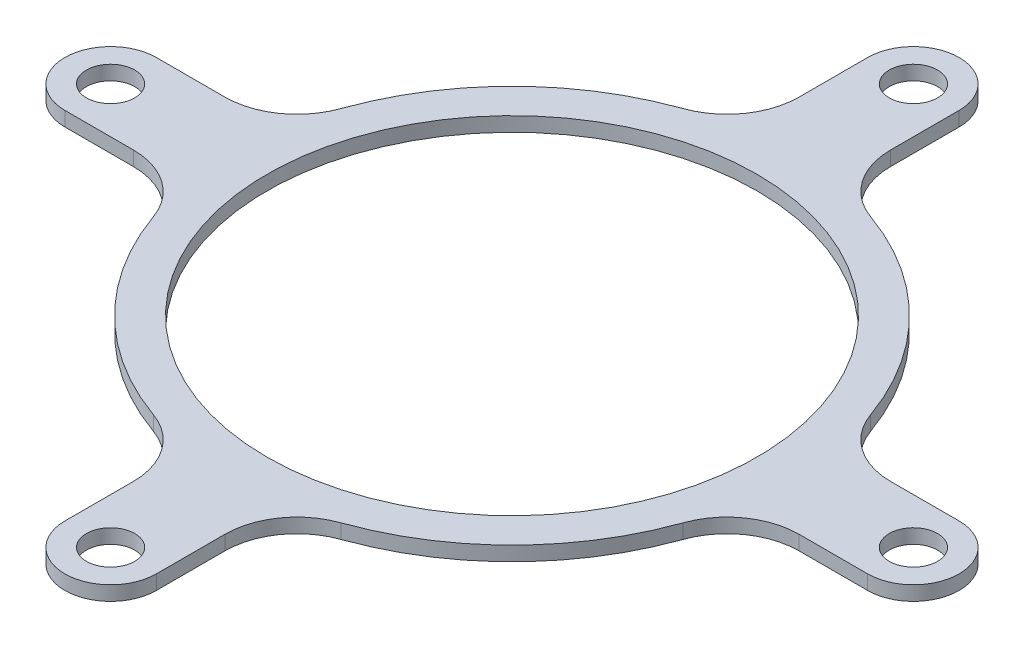
ISO-10303-21;
HEADER;
FILE_DESCRIPTION(('STEP AP214'),'2;1');
FILE_NAME('part.step','',(''),(''),'','','');
FILE_SCHEMA(('AUTOMOTIVE_DESIGN { 1 0 10303 214 1 1 1 1 }'));
ENDSEC;
DATA;
#1=APPLICATION_CONTEXT('core data for automotive mechanical design processes');
#2=APPLICATION_PROTOCOL_DEFINITION('international standard','automotive_design',2000,#1);
#3=PRODUCT_CONTEXT('',#1,'mechanical');
#4=PRODUCT('Part','Part','',(#3));
#5=PRODUCT_RELATED_PRODUCT_CATEGORY('part','',(#4));
#6=PRODUCT_DEFINITION_FORMATION('','',#4);
#7=PRODUCT_DEFINITION_CONTEXT('part definition',#1,'design');
#8=PRODUCT_DEFINITION('design','',#6,#7);
#9=PRODUCT_DEFINITION_SHAPE('','',#8);
#10=(LENGTH_UNIT() NAMED_UNIT(*) SI_UNIT(.MILLI.,.METRE.));
#11=(NAMED_UNIT(*) PLANE_ANGLE_UNIT() SI_UNIT($,.RADIAN.));
#12=(NAMED_UNIT(*) SI_UNIT($,.STERADIAN.) SOLID_ANGLE_UNIT());
#13=UNCERTAINTY_MEASURE_WITH_UNIT(LENGTH_MEASURE(1.E-05),#10,'distance_accuracy_value','');
#14=(GEOMETRIC_REPRESENTATION_CONTEXT(3) GLOBAL_UNCERTAINTY_ASSIGNED_CONTEXT((#13)) GLOBAL_UNIT_ASSIGNED_CONTEXT((#10,
#11,#12)) REPRESENTATION_CONTEXT('',''));
#15=CARTESIAN_POINT('',(0.,0.,0.));
#16=DIRECTION('',(0.,0.,1.));
#17=DIRECTION('',(1.,0.,0.));
#18=AXIS2_PLACEMENT_3D('',#15,#16,#17);
#19=CARTESIAN_POINT('',(0.,1.,0.));
#20=DIRECTION('',(0.,-1.,0.));
#21=DIRECTION('',(0.,0.,-1.));
#22=AXIS2_PLACEMENT_3D('',#19,#20,#21);
#23=CYLINDRICAL_SURFACE('',#22,39.);
#24=DIRECTION('',(0.,1.,0.));
#25=VECTOR('',#24,1.);
#26=CARTESIAN_POINT('',(36.7648599354392,-37.2866174201258,-13.0132653061228));
#27=LINE('',#26,#25);
#28=CARTESIAN_POINT('',(36.7648599354392,-1.,-13.0132653061228));
#29=VERTEX_POINT('',#28);
#30=CARTESIAN_POINT('',(36.7648599354392,1.,-13.0132653061228));
#31=VERTEX_POINT('',#30);
#32=EDGE_CURVE('E236',#29,#31,#27,.T.);
#33=ORIENTED_EDGE('',*,*,#32,.F.);
#34=CARTESIAN_POINT('',(0.,-1.,0.));
#35=DIRECTION('',(0.,1.,0.));
#36=DIRECTION('',(0.,0.,1.));
#37=AXIS2_PLACEMENT_3D('',#34,#35,#36);
#38=CIRCLE('',#37,39.);
#39=CARTESIAN_POINT('',(13.0132653061225,-1.,-36.7648599354393));
#40=VERTEX_POINT('',#39);
#41=EDGE_CURVE('E386',#29,#40,#38,.T.);
#42=ORIENTED_EDGE('',*,*,#41,.T.);
#43=DIRECTION('',(0.,1.,0.));
#44=VECTOR('',#43,1.);
#45=CARTESIAN_POINT('',(13.0132653061225,-37.2866174201258,-36.7648599354393));
#46=LINE('',#45,#44);
#47=CARTESIAN_POINT('',(13.0132653061225,1.,-36.7648599354393));
#48=VERTEX_POINT('',#47);
#49=EDGE_CURVE('E376',#40,#48,#46,.T.);
#50=ORIENTED_EDGE('',*,*,#49,.T.);
#51=CARTESIAN_POINT('',(0.,1.,0.));
#52=DIRECTION('',(0.,1.,0.));
#53=DIRECTION('',(0.,0.,1.));
#54=AXIS2_PLACEMENT_3D('',#51,#52,#53);
#55=CIRCLE('',#54,39.);
#56=EDGE_CURVE('E47',#31,#48,#55,.T.);
#57=ORIENTED_EDGE('',*,*,#56,.F.);
#58=EDGE_LOOP('',(#33,#42,#50,#57));
#59=FACE_BOUND('',#58,.T.);
#60=ADVANCED_FACE('F37',(#59),#23,.T.);
#61=CARTESIAN_POINT('',(13.0132653061224,-1.,36.7648599354393));
#62=VERTEX_POINT('',#61);
#63=CARTESIAN_POINT('',(36.7648599354394,-1.,13.0132653061221));
#64=VERTEX_POINT('',#63);
#65=EDGE_CURVE('E444',#62,#64,#38,.T.);
#66=ORIENTED_EDGE('',*,*,#65,.T.);
#67=DIRECTION('',(0.,1.,0.));
#68=VECTOR('',#67,1.);
#69=CARTESIAN_POINT('',(36.7648599354394,-37.2866174201258,13.0132653061221));
#70=LINE('',#69,#68);
#71=CARTESIAN_POINT('',(36.7648599354394,1.,13.0132653061221));
#72=VERTEX_POINT('',#71);
#73=EDGE_CURVE('E61',#64,#72,#70,.T.);
#74=ORIENTED_EDGE('',*,*,#73,.T.);
#75=CARTESIAN_POINT('',(13.0132653061225,1.,36.7648599354393));
#76=VERTEX_POINT('',#75);
#77=EDGE_CURVE('E224',#76,#72,#55,.T.);
#78=ORIENTED_EDGE('',*,*,#77,.F.);
#79=DIRECTION('',(0.,1.,0.));
#80=VECTOR('',#79,1.);
#81=CARTESIAN_POINT('',(13.0132653061224,-37.2866174201258,36.7648599354393));
#82=LINE('',#81,#80);
#83=EDGE_CURVE('E278',#62,#76,#82,.T.);
#84=ORIENTED_EDGE('',*,*,#83,.F.);
#85=EDGE_LOOP('',(#66,#74,#78,#84));
#86=FACE_BOUND('',#85,.T.);
#87=ADVANCED_FACE('F410',(#86),#23,.T.);
#88=CARTESIAN_POINT('',(-36.7648599354393,-1.,13.0132653061226));
#89=VERTEX_POINT('',#88);
#90=CARTESIAN_POINT('',(-13.0132653061225,-1.,36.7648599354393));
#91=VERTEX_POINT('',#90);
#92=EDGE_CURVE('E440',#89,#91,#38,.T.);
#93=ORIENTED_EDGE('',*,*,#92,.T.);
#94=DIRECTION('',(0.,1.,0.));
#95=VECTOR('',#94,1.);
#96=CARTESIAN_POINT('',(-13.0132653061225,-37.2866174201258,36.7648599354393));
#97=LINE('',#96,#95);
#98=CARTESIAN_POINT('',(-13.0132653061225,1.,36.7648599354393));
#99=VERTEX_POINT('',#98);
#100=EDGE_CURVE('E286',#91,#99,#97,.T.);
#101=ORIENTED_EDGE('',*,*,#100,.T.);
#102=CARTESIAN_POINT('',(-36.7648599354393,1.,13.0132653061226));
#103=VERTEX_POINT('',#102);
#104=EDGE_CURVE('E46',#103,#99,#55,.T.);
#105=ORIENTED_EDGE('',*,*,#104,.F.);
#106=DIRECTION('',(0.,1.,0.));
#107=VECTOR('',#106,1.);
#108=CARTESIAN_POINT('',(-36.7648599354392,-37.2866174201258,13.0132653061226));
#109=LINE('',#108,#107);
#110=EDGE_CURVE('E323',#89,#103,#109,.T.);
#111=ORIENTED_EDGE('',*,*,#110,.F.);
#112=EDGE_LOOP('',(#93,#101,#105,#111));
#113=FACE_BOUND('',#112,.T.);
#114=ADVANCED_FACE('F406',(#113),#23,.T.);
#115=CARTESIAN_POINT('',(0.,1.,0.));
#116=DIRECTION('',(0.,1.,0.));
#117=DIRECTION('',(0.,0.,1.));
#118=AXIS2_PLACEMENT_3D('',#115,#116,#117);
#119=PLANE('',#118);
#120=CARTESIAN_POINT('',(-13.0132653061225,1.,-36.7648599354393));
#121=VERTEX_POINT('',#120);
#122=CARTESIAN_POINT('',(-36.7648599354393,1.,-13.0132653061223));
#123=VERTEX_POINT('',#122);
#124=EDGE_CURVE('E11',#121,#123,#55,.T.);
#125=ORIENTED_EDGE('',*,*,#124,.T.);
#126=CARTESIAN_POINT('',(-46.1917470983725,1.,-16.3499999999998));
#127=DIRECTION('',(0.,-1.,0.));
#128=DIRECTION('',(1.,0.,0.));
#129=AXIS2_PLACEMENT_3D('',#126,#127,#128);
#130=CIRCLE('',#129,10.);
#131=CARTESIAN_POINT('',(-46.1917470983725,1.,-6.34999999999984));
#132=VERTEX_POINT('',#131);
#133=EDGE_CURVE('E311',#123,#132,#130,.T.);
#134=ORIENTED_EDGE('',*,*,#133,.T.);
#135=DIRECTION('',(-1.,0.,0.));
#136=VECTOR('',#135,1.);
#137=CARTESIAN_POINT('',(-55.7,1.,-6.34999999999981));
#138=LINE('',#137,#136);
#139=CARTESIAN_POINT('',(-55.7,1.,-6.34999999999981));
#140=VERTEX_POINT('',#139);
#141=EDGE_CURVE('E314',#132,#140,#138,.T.);
#142=ORIENTED_EDGE('',*,*,#141,.T.);
#143=CARTESIAN_POINT('',(-55.7,1.,1.94475510573563E-13));
#144=DIRECTION('',(0.,1.,0.));
#145=DIRECTION('',(-1.,0.,0.));
#146=AXIS2_PLACEMENT_3D('',#143,#144,#145);
#147=CIRCLE('',#146,6.35);
#148=CARTESIAN_POINT('',(-55.7,1.,6.3500000000002));
#149=VERTEX_POINT('',#148);
#150=EDGE_CURVE('E317',#140,#149,#147,.T.);
#151=ORIENTED_EDGE('',*,*,#150,.T.);
#152=DIRECTION('',(1.,0.,0.));
#153=VECTOR('',#152,1.);
#154=CARTESIAN_POINT('',(-46.1917470983724,1.,6.35000000000016));
#155=LINE('',#154,#153);
#156=CARTESIAN_POINT('',(-46.1917470983724,1.,6.35000000000016));
#157=VERTEX_POINT('',#156);
#158=EDGE_CURVE('E320',#149,#157,#155,.T.);
#159=ORIENTED_EDGE('',*,*,#158,.T.);
#160=CARTESIAN_POINT('',(-46.1917470983724,1.,16.3500000000002));
#161=DIRECTION('',(0.,-1.,0.));
#162=DIRECTION('',(-1.,0.,0.));
#163=AXIS2_PLACEMENT_3D('',#160,#161,#162);
#164=CIRCLE('',#163,10.);
#165=EDGE_CURVE('E308',#157,#103,#164,.T.);
#166=ORIENTED_EDGE('',*,*,#165,.T.);
#167=ORIENTED_EDGE('',*,*,#104,.T.);
#168=CARTESIAN_POINT('',(-16.35,1.,46.1917470983725));
#169=DIRECTION('',(0.,-1.,0.));
#170=DIRECTION('',(0.,0.,-1.));
#171=AXIS2_PLACEMENT_3D('',#168,#169,#170);
#172=CIRCLE('',#171,10.);
#173=CARTESIAN_POINT('',(-6.35,1.,46.1917470983725));
#174=VERTEX_POINT('',#173);
#175=EDGE_CURVE('E266',#99,#174,#172,.T.);
#176=ORIENTED_EDGE('',*,*,#175,.T.);
#177=DIRECTION('',(0.,0.,1.));
#178=VECTOR('',#177,1.);
#179=CARTESIAN_POINT('',(-6.35,1.,55.7));
#180=LINE('',#179,#178);
#181=CARTESIAN_POINT('',(-6.35,1.,55.7));
#182=VERTEX_POINT('',#181);
#183=EDGE_CURVE('E269',#174,#182,#180,.T.);
#184=ORIENTED_EDGE('',*,*,#183,.T.);
#185=CARTESIAN_POINT('',(0.,1.,55.7));
#186=DIRECTION('',(0.,1.,0.));
#187=DIRECTION('',(0.,0.,1.));
#188=AXIS2_PLACEMENT_3D('',#185,#186,#187);
#189=CIRCLE('',#188,6.35);
#190=CARTESIAN_POINT('',(6.35,1.,55.7));
#191=VERTEX_POINT('',#190);
#192=EDGE_CURVE('E272',#182,#191,#189,.T.);
#193=ORIENTED_EDGE('',*,*,#192,.T.);
#194=DIRECTION('',(0.,0.,-1.));
#195=VECTOR('',#194,1.);
#196=CARTESIAN_POINT('',(6.35,1.,46.1917470983725));
#197=LINE('',#196,#195);
#198=CARTESIAN_POINT('',(6.35,1.,46.1917470983725));
#199=VERTEX_POINT('',#198);
#200=EDGE_CURVE('E275',#191,#199,#197,.T.);
#201=ORIENTED_EDGE('',*,*,#200,.T.);
#202=CARTESIAN_POINT('',(16.35,1.,46.1917470983725));
#203=DIRECTION('',(0.,-1.,0.));
#204=DIRECTION('',(0.,0.,1.));
#205=AXIS2_PLACEMENT_3D('',#202,#203,#204);
#206=CIRCLE('',#205,10.);
#207=EDGE_CURVE('E264',#199,#76,#206,.T.);
#208=ORIENTED_EDGE('',*,*,#207,.T.);
#209=ORIENTED_EDGE('',*,*,#77,.T.);
#210=CARTESIAN_POINT('',(46.1917470983726,1.,16.3499999999995));
#211=DIRECTION('',(0.,-1.,0.));
#212=DIRECTION('',(-1.,0.,0.));
#213=AXIS2_PLACEMENT_3D('',#210,#211,#212);
#214=CIRCLE('',#213,10.);
#215=CARTESIAN_POINT('',(46.1917470983725,1.,6.34999999999952));
#216=VERTEX_POINT('',#215);
#217=EDGE_CURVE('E205',#72,#216,#214,.T.);
#218=ORIENTED_EDGE('',*,*,#217,.T.);
#219=DIRECTION('',(1.,0.,0.));
#220=VECTOR('',#219,1.);
#221=CARTESIAN_POINT('',(55.7000000000001,1.,6.34999999999942));
#222=LINE('',#221,#220);
#223=CARTESIAN_POINT('',(55.7000000000001,1.,6.34999999999942));
#224=VERTEX_POINT('',#223);
#225=EDGE_CURVE('E213',#216,#224,#222,.T.);
#226=ORIENTED_EDGE('',*,*,#225,.T.);
#227=CARTESIAN_POINT('',(55.7,1.,-5.83426531720688E-13));
#228=DIRECTION('',(0.,1.,0.));
#229=DIRECTION('',(1.,0.,0.));
#230=AXIS2_PLACEMENT_3D('',#227,#228,#229);
#231=CIRCLE('',#230,6.35);
#232=CARTESIAN_POINT('',(55.6999999999999,1.,-6.35000000000058));
#233=VERTEX_POINT('',#232);
#234=EDGE_CURVE('E219',#224,#233,#231,.T.);
#235=ORIENTED_EDGE('',*,*,#234,.T.);
#236=DIRECTION('',(-1.,0.,0.));
#237=VECTOR('',#236,1.);
#238=CARTESIAN_POINT('',(46.1917470983724,1.,-6.35000000000048));
#239=LINE('',#238,#237);
#240=CARTESIAN_POINT('',(46.1917470983724,1.,-6.35000000000048));
#241=VERTEX_POINT('',#240);
#242=EDGE_CURVE('E233',#233,#241,#239,.T.);
#243=ORIENTED_EDGE('',*,*,#242,.T.);
#244=CARTESIAN_POINT('',(46.1917470983723,1.,-16.3500000000005));
#245=DIRECTION('',(0.,-1.,0.));
#246=DIRECTION('',(1.,0.,0.));
#247=AXIS2_PLACEMENT_3D('',#244,#245,#246);
#248=CIRCLE('',#247,10.);
#249=EDGE_CURVE('E225',#241,#31,#248,.T.);
#250=ORIENTED_EDGE('',*,*,#249,.T.);
#251=ORIENTED_EDGE('',*,*,#56,.T.);
#252=CARTESIAN_POINT('',(16.35,1.,-46.1917470983725));
#253=DIRECTION('',(0.,-1.,0.));
#254=DIRECTION('',(0.,0.,1.));
#255=AXIS2_PLACEMENT_3D('',#252,#253,#254);
#256=CIRCLE('',#255,10.);
#257=CARTESIAN_POINT('',(6.35,1.,-46.1917470983725));
#258=VERTEX_POINT('',#257);
#259=EDGE_CURVE('E356',#48,#258,#256,.T.);
#260=ORIENTED_EDGE('',*,*,#259,.T.);
#261=DIRECTION('',(0.,0.,-1.));
#262=VECTOR('',#261,1.);
#263=CARTESIAN_POINT('',(6.35,1.,-55.7));
#264=LINE('',#263,#262);
#265=CARTESIAN_POINT('',(6.35,1.,-55.7));
#266=VERTEX_POINT('',#265);
#267=EDGE_CURVE('E359',#258,#266,#264,.T.);
#268=ORIENTED_EDGE('',*,*,#267,.T.);
#269=CARTESIAN_POINT('',(0.,1.,-55.7));
#270=DIRECTION('',(0.,1.,0.));
#271=DIRECTION('',(0.,0.,-1.));
#272=AXIS2_PLACEMENT_3D('',#269,#270,#271);
#273=CIRCLE('',#272,6.35);
#274=CARTESIAN_POINT('',(-6.35,1.,-55.7));
#275=VERTEX_POINT('',#274);
#276=EDGE_CURVE('E362',#266,#275,#273,.T.);
#277=ORIENTED_EDGE('',*,*,#276,.T.);
#278=DIRECTION('',(0.,0.,1.));
#279=VECTOR('',#278,1.);
#280=CARTESIAN_POINT('',(-6.35,1.,-46.1917470983725));
#281=LINE('',#280,#279);
#282=CARTESIAN_POINT('',(-6.35,1.,-46.1917470983725));
#283=VERTEX_POINT('',#282);
#284=EDGE_CURVE('E365',#275,#283,#281,.T.);
#285=ORIENTED_EDGE('',*,*,#284,.T.);
#286=CARTESIAN_POINT('',(-16.35,1.,-46.1917470983725));
#287=DIRECTION('',(0.,-1.,0.));
#288=DIRECTION('',(0.,0.,-1.));
#289=AXIS2_PLACEMENT_3D('',#286,#287,#288);
#290=CIRCLE('',#289,10.);
#291=EDGE_CURVE('E353',#283,#121,#290,.T.);
#292=ORIENTED_EDGE('',*,*,#291,.T.);
#293=EDGE_LOOP('',(#125,#134,#142,#151,#159,#166,#167,#176,#184,#193,#201,#208,#209,#218,#226,
#235,#243,#250,#251,#260,#268,#277,#285,#292));
#294=FACE_BOUND('',#293,.T.);
#295=CARTESIAN_POINT('',(0.,1.,0.));
#296=DIRECTION('',(0.,1.,0.));
#297=DIRECTION('',(0.,0.,1.));
#298=AXIS2_PLACEMENT_3D('',#295,#296,#297);
#299=CIRCLE('',#298,34.);
#300=CARTESIAN_POINT('',(0.,1.,34.));
#301=VERTEX_POINT('',#300);
#302=EDGE_CURVE('E383',#301,#301,#299,.T.);
#303=ORIENTED_EDGE('',*,*,#302,.F.);
#304=EDGE_LOOP('',(#303));
#305=FACE_BOUND('',#304,.T.);
#306=CARTESIAN_POINT('',(0.,1.,-55.7));
#307=DIRECTION('',(0.,1.,0.));
#308=DIRECTION('',(0.,0.,1.));
#309=AXIS2_PLACEMENT_3D('',#306,#307,#308);
#310=CIRCLE('',#309,3.35);
#311=CARTESIAN_POINT('',(0.,1.,-52.35));
#312=VERTEX_POINT('',#311);
#313=EDGE_CURVE('E337',#312,#312,#310,.T.);
#314=ORIENTED_EDGE('',*,*,#313,.F.);
#315=EDGE_LOOP('',(#314));
#316=FACE_BOUND('',#315,.T.);
#317=CARTESIAN_POINT('',(-55.7,1.,1.94475510573563E-13));
#318=DIRECTION('',(0.,1.,0.));
#319=DIRECTION('',(1.,0.,0.));
#320=AXIS2_PLACEMENT_3D('',#317,#318,#319);
#321=CIRCLE('',#320,3.35);
#322=CARTESIAN_POINT('',(-52.35,1.,1.82779048088438E-13));
#323=VERTEX_POINT('',#322);
#324=EDGE_CURVE('E292',#323,#323,#321,.T.);
#325=ORIENTED_EDGE('',*,*,#324,.F.);
#326=EDGE_LOOP('',(#325));
#327=FACE_BOUND('',#326,.T.);
#328=CARTESIAN_POINT('',(0.,1.,55.7));
#329=DIRECTION('',(0.,1.,0.));
#330=DIRECTION('',(0.,0.,-1.));
#331=AXIS2_PLACEMENT_3D('',#328,#329,#330);
#332=CIRCLE('',#331,3.35);
#333=CARTESIAN_POINT('',(0.,1.,52.35));
#334=VERTEX_POINT('',#333);
#335=EDGE_CURVE('E247',#334,#334,#332,.T.);
#336=ORIENTED_EDGE('',*,*,#335,.F.);
#337=EDGE_LOOP('',(#336));
#338=FACE_BOUND('',#337,.T.);
#339=CARTESIAN_POINT('',(55.7,1.,-5.83426531720688E-13));
#340=DIRECTION('',(0.,1.,0.));
#341=DIRECTION('',(-1.,0.,0.));
#342=AXIS2_PLACEMENT_3D('',#339,#340,#341);
#343=CIRCLE('',#342,3.35);
#344=CARTESIAN_POINT('',(52.35,1.,-5.48337144265314E-13));
#345=VERTEX_POINT('',#344);
#346=EDGE_CURVE('E228',#345,#345,#343,.T.);
#347=ORIENTED_EDGE('',*,*,#346,.F.);
#348=EDGE_LOOP('',(#347));
#349=FACE_BOUND('',#348,.T.);
#350=ADVANCED_FACE('F221',(#294,#305,#316,#327,#338,#349),#119,.T.);
#351=CARTESIAN_POINT('',(0.,-1.,0.));
#352=DIRECTION('',(0.,1.,0.));
#353=DIRECTION('',(0.,0.,1.));
#354=AXIS2_PLACEMENT_3D('',#351,#352,#353);
#355=PLANE('',#354);
#356=CARTESIAN_POINT('',(-13.0132653061224,-1.,-36.7648599354393));
#357=VERTEX_POINT('',#356);
#358=CARTESIAN_POINT('',(-36.7648599354393,-1.,-13.0132653061223));
#359=VERTEX_POINT('',#358);
#360=EDGE_CURVE('E41',#357,#359,#38,.T.);
#361=ORIENTED_EDGE('',*,*,#360,.F.);
#362=CARTESIAN_POINT('',(-16.35,-1.,-46.1917470983725));
#363=DIRECTION('',(0.,1.,0.));
#364=DIRECTION('',(0.,0.,1.));
#365=AXIS2_PLACEMENT_3D('',#362,#363,#364);
#366=CIRCLE('',#365,10.);
#367=CARTESIAN_POINT('',(-6.35,-1.,-46.1917470983725));
#368=VERTEX_POINT('',#367);
#369=EDGE_CURVE('E348',#357,#368,#366,.T.);
#370=ORIENTED_EDGE('',*,*,#369,.T.);
#371=DIRECTION('',(0.,0.,-1.));
#372=VECTOR('',#371,1.);
#373=CARTESIAN_POINT('',(-6.35,-1.,-46.1917470983725));
#374=LINE('',#373,#372);
#375=CARTESIAN_POINT('',(-6.35,-1.,-55.7));
#376=VERTEX_POINT('',#375);
#377=EDGE_CURVE('E346',#368,#376,#374,.T.);
#378=ORIENTED_EDGE('',*,*,#377,.T.);
#379=CARTESIAN_POINT('',(0.,-1.,-55.7));
#380=DIRECTION('',(0.,1.,0.));
#381=DIRECTION('',(0.,0.,1.));
#382=AXIS2_PLACEMENT_3D('',#379,#380,#381);
#383=CIRCLE('',#382,6.35);
#384=CARTESIAN_POINT('',(6.35,-1.,-55.7));
#385=VERTEX_POINT('',#384);
#386=EDGE_CURVE('E344',#376,#385,#383,.F.);
#387=ORIENTED_EDGE('',*,*,#386,.T.);
#388=DIRECTION('',(0.,0.,1.));
#389=VECTOR('',#388,1.);
#390=CARTESIAN_POINT('',(6.35,-1.,-55.7));
#391=LINE('',#390,#389);
#392=CARTESIAN_POINT('',(6.35,-1.,-46.1917470983725));
#393=VERTEX_POINT('',#392);
#394=EDGE_CURVE('E341',#385,#393,#391,.T.);
#395=ORIENTED_EDGE('',*,*,#394,.T.);
#396=CARTESIAN_POINT('',(16.35,-1.,-46.1917470983725));
#397=DIRECTION('',(0.,1.,0.));
#398=DIRECTION('',(0.,0.,1.));
#399=AXIS2_PLACEMENT_3D('',#396,#397,#398);
#400=CIRCLE('',#399,10.);
#401=EDGE_CURVE('E338',#393,#40,#400,.T.);
#402=ORIENTED_EDGE('',*,*,#401,.T.);
#403=ORIENTED_EDGE('',*,*,#41,.F.);
#404=CARTESIAN_POINT('',(46.1917470983723,-1.,-16.3500000000005));
#405=DIRECTION('',(0.,1.,0.));
#406=DIRECTION('',(0.,0.,1.));
#407=AXIS2_PLACEMENT_3D('',#404,#405,#406);
#408=CIRCLE('',#407,10.);
#409=CARTESIAN_POINT('',(46.1917470983724,-1.,-6.35000000000048));
#410=VERTEX_POINT('',#409);
#411=EDGE_CURVE('E248',#29,#410,#408,.T.);
#412=ORIENTED_EDGE('',*,*,#411,.T.);
#413=DIRECTION('',(1.,0.,0.));
#414=VECTOR('',#413,1.);
#415=CARTESIAN_POINT('',(46.1917470983724,-1.,-6.35000000000048));
#416=LINE('',#415,#414);
#417=CARTESIAN_POINT('',(55.6999999999999,-1.,-6.35000000000058));
#418=VERTEX_POINT('',#417);
#419=EDGE_CURVE('E421',#410,#418,#416,.T.);
#420=ORIENTED_EDGE('',*,*,#419,.T.);
#421=CARTESIAN_POINT('',(55.7,-1.,-5.83426531720688E-13));
#422=DIRECTION('',(0.,1.,0.));
#423=DIRECTION('',(0.,0.,1.));
#424=AXIS2_PLACEMENT_3D('',#421,#422,#423);
#425=CIRCLE('',#424,6.35);
#426=CARTESIAN_POINT('',(55.7000000000001,-1.,6.34999999999942));
#427=VERTEX_POINT('',#426);
#428=EDGE_CURVE('E423',#418,#427,#425,.F.);
#429=ORIENTED_EDGE('',*,*,#428,.T.);
#430=DIRECTION('',(-1.,0.,0.));
#431=VECTOR('',#430,1.);
#432=CARTESIAN_POINT('',(55.7000000000001,-1.,6.34999999999942));
#433=LINE('',#432,#431);
#434=CARTESIAN_POINT('',(46.1917470983725,-1.,6.34999999999952));
#435=VERTEX_POINT('',#434);
#436=EDGE_CURVE('E456',#427,#435,#433,.T.);
#437=ORIENTED_EDGE('',*,*,#436,.T.);
#438=CARTESIAN_POINT('',(46.1917470983726,-1.,16.3499999999995));
#439=DIRECTION('',(0.,1.,0.));
#440=DIRECTION('',(0.,0.,1.));
#441=AXIS2_PLACEMENT_3D('',#438,#439,#440);
#442=CIRCLE('',#441,10.);
#443=EDGE_CURVE('E207',#435,#64,#442,.T.);
#444=ORIENTED_EDGE('',*,*,#443,.T.);
#445=ORIENTED_EDGE('',*,*,#65,.F.);
#446=CARTESIAN_POINT('',(16.35,-1.,46.1917470983725));
#447=DIRECTION('',(0.,1.,0.));
#448=DIRECTION('',(0.,0.,1.));
#449=AXIS2_PLACEMENT_3D('',#446,#447,#448);
#450=CIRCLE('',#449,10.);
#451=CARTESIAN_POINT('',(6.35,-1.,46.1917470983725));
#452=VERTEX_POINT('',#451);
#453=EDGE_CURVE('E259',#62,#452,#450,.T.);
#454=ORIENTED_EDGE('',*,*,#453,.T.);
#455=DIRECTION('',(0.,0.,1.));
#456=VECTOR('',#455,1.);
#457=CARTESIAN_POINT('',(6.35,-1.,46.1917470983725));
#458=LINE('',#457,#456);
#459=CARTESIAN_POINT('',(6.35,-1.,55.7));
#460=VERTEX_POINT('',#459);
#461=EDGE_CURVE('E257',#452,#460,#458,.T.);
#462=ORIENTED_EDGE('',*,*,#461,.T.);
#463=CARTESIAN_POINT('',(0.,-1.,55.7));
#464=DIRECTION('',(0.,1.,0.));
#465=DIRECTION('',(0.,0.,1.));
#466=AXIS2_PLACEMENT_3D('',#463,#464,#465);
#467=CIRCLE('',#466,6.35);
#468=CARTESIAN_POINT('',(-6.35,-1.,55.7));
#469=VERTEX_POINT('',#468);
#470=EDGE_CURVE('E255',#460,#469,#467,.F.);
#471=ORIENTED_EDGE('',*,*,#470,.T.);
#472=DIRECTION('',(0.,0.,-1.));
#473=VECTOR('',#472,1.);
#474=CARTESIAN_POINT('',(-6.35,-1.,55.7));
#475=LINE('',#474,#473);
#476=CARTESIAN_POINT('',(-6.35,-1.,46.1917470983725));
#477=VERTEX_POINT('',#476);
#478=EDGE_CURVE('E252',#469,#477,#475,.T.);
#479=ORIENTED_EDGE('',*,*,#478,.T.);
#480=CARTESIAN_POINT('',(-16.35,-1.,46.1917470983725));
#481=DIRECTION('',(0.,1.,0.));
#482=DIRECTION('',(0.,0.,1.));
#483=AXIS2_PLACEMENT_3D('',#480,#481,#482);
#484=CIRCLE('',#483,10.);
#485=EDGE_CURVE('E249',#477,#91,#484,.T.);
#486=ORIENTED_EDGE('',*,*,#485,.T.);
#487=ORIENTED_EDGE('',*,*,#92,.F.);
#488=CARTESIAN_POINT('',(-46.1917470983724,-1.,16.3500000000002));
#489=DIRECTION('',(0.,1.,0.));
#490=DIRECTION('',(0.,0.,1.));
#491=AXIS2_PLACEMENT_3D('',#488,#489,#490);
#492=CIRCLE('',#491,10.);
#493=CARTESIAN_POINT('',(-46.1917470983724,-1.,6.35000000000016));
#494=VERTEX_POINT('',#493);
#495=EDGE_CURVE('E303',#89,#494,#492,.T.);
#496=ORIENTED_EDGE('',*,*,#495,.T.);
#497=DIRECTION('',(-1.,0.,0.));
#498=VECTOR('',#497,1.);
#499=CARTESIAN_POINT('',(-46.1917470983724,-1.,6.35000000000016));
#500=LINE('',#499,#498);
#501=CARTESIAN_POINT('',(-55.7,-1.,6.3500000000002));
#502=VERTEX_POINT('',#501);
#503=EDGE_CURVE('E301',#494,#502,#500,.T.);
#504=ORIENTED_EDGE('',*,*,#503,.T.);
#505=CARTESIAN_POINT('',(-55.7,-1.,1.94475510573563E-13));
#506=DIRECTION('',(0.,1.,0.));
#507=DIRECTION('',(0.,0.,1.));
#508=AXIS2_PLACEMENT_3D('',#505,#506,#507);
#509=CIRCLE('',#508,6.35);
#510=CARTESIAN_POINT('',(-55.7,-1.,-6.34999999999981));
#511=VERTEX_POINT('',#510);
#512=EDGE_CURVE('E299',#502,#511,#509,.F.);
#513=ORIENTED_EDGE('',*,*,#512,.T.);
#514=DIRECTION('',(1.,0.,0.));
#515=VECTOR('',#514,1.);
#516=CARTESIAN_POINT('',(-55.7,-1.,-6.34999999999981));
#517=LINE('',#516,#515);
#518=CARTESIAN_POINT('',(-46.1917470983725,-1.,-6.34999999999984));
#519=VERTEX_POINT('',#518);
#520=EDGE_CURVE('E296',#511,#519,#517,.T.);
#521=ORIENTED_EDGE('',*,*,#520,.T.);
#522=CARTESIAN_POINT('',(-46.1917470983725,-1.,-16.3499999999998));
#523=DIRECTION('',(0.,1.,0.));
#524=DIRECTION('',(0.,0.,1.));
#525=AXIS2_PLACEMENT_3D('',#522,#523,#524);
#526=CIRCLE('',#525,10.);
#527=EDGE_CURVE('E293',#519,#359,#526,.T.);
#528=ORIENTED_EDGE('',*,*,#527,.T.);
#529=EDGE_LOOP('',(#361,#370,#378,#387,#395,#402,#403,#412,#420,#429,#437,#444,#445,#454,#462,
#471,#479,#486,#487,#496,#504,#513,#521,#528));
#530=FACE_BOUND('',#529,.T.);
#531=CARTESIAN_POINT('',(0.,-1.,0.));
#532=DIRECTION('',(0.,1.,0.));
#533=DIRECTION('',(0.,0.,1.));
#534=AXIS2_PLACEMENT_3D('',#531,#532,#533);
#535=CIRCLE('',#534,34.);
#536=CARTESIAN_POINT('',(0.,-1.,34.));
#537=VERTEX_POINT('',#536);
#538=EDGE_CURVE('E382',#537,#537,#535,.T.);
#539=ORIENTED_EDGE('',*,*,#538,.T.);
#540=EDGE_LOOP('',(#539));
#541=FACE_BOUND('',#540,.T.);
#542=CARTESIAN_POINT('',(0.,-1.,-55.7));
#543=DIRECTION('',(0.,1.,0.));
#544=DIRECTION('',(0.,0.,1.));
#545=AXIS2_PLACEMENT_3D('',#542,#543,#544);
#546=CIRCLE('',#545,3.35);
#547=CARTESIAN_POINT('',(0.,-1.,-52.35));
#548=VERTEX_POINT('',#547);
#549=EDGE_CURVE('E350',#548,#548,#546,.F.);
#550=ORIENTED_EDGE('',*,*,#549,.F.);
#551=EDGE_LOOP('',(#550));
#552=FACE_BOUND('',#551,.T.);
#553=CARTESIAN_POINT('',(-55.7,-1.,1.94475510573563E-13));
#554=DIRECTION('',(0.,1.,0.));
#555=DIRECTION('',(0.,0.,1.));
#556=AXIS2_PLACEMENT_3D('',#553,#554,#555);
#557=CIRCLE('',#556,3.35);
#558=CARTESIAN_POINT('',(-55.7,-1.,3.3500000000002));
#559=VERTEX_POINT('',#558);
#560=EDGE_CURVE('E305',#559,#559,#557,.F.);
#561=ORIENTED_EDGE('',*,*,#560,.F.);
#562=EDGE_LOOP('',(#561));
#563=FACE_BOUND('',#562,.T.);
#564=CARTESIAN_POINT('',(0.,-1.,55.7));
#565=DIRECTION('',(0.,1.,0.));
#566=DIRECTION('',(0.,0.,1.));
#567=AXIS2_PLACEMENT_3D('',#564,#565,#566);
#568=CIRCLE('',#567,3.35);
#569=CARTESIAN_POINT('',(0.,-1.,59.05));
#570=VERTEX_POINT('',#569);
#571=EDGE_CURVE('E261',#570,#570,#568,.F.);
#572=ORIENTED_EDGE('',*,*,#571,.F.);
#573=EDGE_LOOP('',(#572));
#574=FACE_BOUND('',#573,.T.);
#575=CARTESIAN_POINT('',(55.7,-1.,-5.83426531720688E-13));
#576=DIRECTION('',(0.,1.,0.));
#577=DIRECTION('',(0.,0.,1.));
#578=AXIS2_PLACEMENT_3D('',#575,#576,#577);
#579=CIRCLE('',#578,3.35);
#580=CARTESIAN_POINT('',(55.7,-1.,3.34999999999942));
#581=VERTEX_POINT('',#580);
#582=EDGE_CURVE('E244',#581,#581,#579,.F.);
#583=ORIENTED_EDGE('',*,*,#582,.F.);
#584=EDGE_LOOP('',(#583));
#585=FACE_BOUND('',#584,.T.);
#586=ADVANCED_FACE('F390',(#530,#541,#552,#563,#574,#585),#355,.F.);
#587=ORIENTED_EDGE('',*,*,#360,.T.);
#588=DIRECTION('',(0.,1.,0.));
#589=VECTOR('',#588,1.);
#590=CARTESIAN_POINT('',(-36.7648599354393,-37.2866174201258,-13.0132653061223));
#591=LINE('',#590,#589);
#592=EDGE_CURVE('E331',#359,#123,#591,.T.);
#593=ORIENTED_EDGE('',*,*,#592,.T.);
#594=ORIENTED_EDGE('',*,*,#124,.F.);
#595=DIRECTION('',(0.,1.,0.));
#596=VECTOR('',#595,1.);
#597=CARTESIAN_POINT('',(-13.0132653061224,-37.2866174201258,-36.7648599354393));
#598=LINE('',#597,#596);
#599=EDGE_CURVE('E368',#357,#121,#598,.T.);
#600=ORIENTED_EDGE('',*,*,#599,.F.);
#601=EDGE_LOOP('',(#587,#593,#594,#600));
#602=FACE_BOUND('',#601,.T.);
#603=ADVANCED_FACE('F39',(#602),#23,.T.);
#604=CARTESIAN_POINT('',(0.,1.,0.));
#605=DIRECTION('',(0.,-1.,0.));
#606=DIRECTION('',(0.,0.,-1.));
#607=AXIS2_PLACEMENT_3D('',#604,#605,#606);
#608=CYLINDRICAL_SURFACE('',#607,34.);
#609=ORIENTED_EDGE('',*,*,#302,.T.);
#610=EDGE_LOOP('',(#609));
#611=FACE_BOUND('',#610,.T.);
#612=ORIENTED_EDGE('',*,*,#538,.F.);
#613=EDGE_LOOP('',(#612));
#614=FACE_BOUND('',#613,.T.);
#615=ADVANCED_FACE('F393',(#611,#614),#608,.F.);
#616=CARTESIAN_POINT('',(16.35,-37.2866174201258,-46.1917470983725));
#617=DIRECTION('',(0.,1.,0.));
#618=DIRECTION('',(0.,0.,1.));
#619=AXIS2_PLACEMENT_3D('',#616,#617,#618);
#620=CYLINDRICAL_SURFACE('',#619,10.);
#621=ORIENTED_EDGE('',*,*,#401,.F.);
#622=DIRECTION('',(0.,1.,0.));
#623=VECTOR('',#622,1.);
#624=CARTESIAN_POINT('',(6.35,-37.2866174201258,-46.1917470983725));
#625=LINE('',#624,#623);
#626=EDGE_CURVE('E374',#393,#258,#625,.T.);
#627=ORIENTED_EDGE('',*,*,#626,.T.);
#628=ORIENTED_EDGE('',*,*,#259,.F.);
#629=ORIENTED_EDGE('',*,*,#49,.F.);
#630=EDGE_LOOP('',(#621,#627,#628,#629));
#631=FACE_BOUND('',#630,.T.);
#632=ADVANCED_FACE('F395',(#631),#620,.F.);
#633=CARTESIAN_POINT('',(6.35,-37.2866174201258,-55.7));
#634=DIRECTION('',(1.,0.,0.));
#635=DIRECTION('',(0.,0.,-1.));
#636=AXIS2_PLACEMENT_3D('',#633,#634,#635);
#637=PLANE('',#636);
#638=ORIENTED_EDGE('',*,*,#394,.F.);
#639=DIRECTION('',(0.,1.,0.));
#640=VECTOR('',#639,1.);
#641=CARTESIAN_POINT('',(6.35,-37.2866174201258,-55.7));
#642=LINE('',#641,#640);
#643=EDGE_CURVE('E372',#385,#266,#642,.T.);
#644=ORIENTED_EDGE('',*,*,#643,.T.);
#645=ORIENTED_EDGE('',*,*,#267,.F.);
#646=ORIENTED_EDGE('',*,*,#626,.F.);
#647=EDGE_LOOP('',(#638,#644,#645,#646));
#648=FACE_BOUND('',#647,.T.);
#649=ADVANCED_FACE('F402',(#648),#637,.T.);
#650=CARTESIAN_POINT('',(0.,-37.2866174201258,-55.7));
#651=DIRECTION('',(0.,1.,0.));
#652=DIRECTION('',(0.,0.,1.));
#653=AXIS2_PLACEMENT_3D('',#650,#651,#652);
#654=CYLINDRICAL_SURFACE('',#653,6.35);
#655=ORIENTED_EDGE('',*,*,#386,.F.);
#656=DIRECTION('',(0.,1.,0.));
#657=VECTOR('',#656,1.);
#658=CARTESIAN_POINT('',(-6.35,-37.2866174201258,-55.7));
#659=LINE('',#658,#657);
#660=EDGE_CURVE('E370',#376,#275,#659,.T.);
#661=ORIENTED_EDGE('',*,*,#660,.T.);
#662=ORIENTED_EDGE('',*,*,#276,.F.);
#663=ORIENTED_EDGE('',*,*,#643,.F.);
#664=EDGE_LOOP('',(#655,#661,#662,#663));
#665=FACE_BOUND('',#664,.T.);
#666=ADVANCED_FACE('F534',(#665),#654,.T.);
#667=CARTESIAN_POINT('',(-6.35,-37.2866174201258,-46.1917470983725));
#668=DIRECTION('',(-1.,0.,0.));
#669=DIRECTION('',(0.,0.,1.));
#670=AXIS2_PLACEMENT_3D('',#667,#668,#669);
#671=PLANE('',#670);
#672=ORIENTED_EDGE('',*,*,#377,.F.);
#673=DIRECTION('',(0.,1.,0.));
#674=VECTOR('',#673,1.);
#675=CARTESIAN_POINT('',(-6.35,-37.2866174201258,-46.1917470983725));
#676=LINE('',#675,#674);
#677=EDGE_CURVE('E342',#368,#283,#676,.T.);
#678=ORIENTED_EDGE('',*,*,#677,.T.);
#679=ORIENTED_EDGE('',*,*,#284,.F.);
#680=ORIENTED_EDGE('',*,*,#660,.F.);
#681=EDGE_LOOP('',(#672,#678,#679,#680));
#682=FACE_BOUND('',#681,.T.);
#683=ADVANCED_FACE('F531',(#682),#671,.T.);
#684=CARTESIAN_POINT('',(-16.35,-37.2866174201258,-46.1917470983725));
#685=DIRECTION('',(0.,1.,0.));
#686=DIRECTION('',(0.,0.,1.));
#687=AXIS2_PLACEMENT_3D('',#684,#685,#686);
#688=CYLINDRICAL_SURFACE('',#687,10.);
#689=ORIENTED_EDGE('',*,*,#369,.F.);
#690=ORIENTED_EDGE('',*,*,#599,.T.);
#691=ORIENTED_EDGE('',*,*,#291,.F.);
#692=ORIENTED_EDGE('',*,*,#677,.F.);
#693=EDGE_LOOP('',(#689,#690,#691,#692));
#694=FACE_BOUND('',#693,.T.);
#695=ADVANCED_FACE('F529',(#694),#688,.F.);
#696=CARTESIAN_POINT('',(0.,-37.2866174201258,-55.7));
#697=DIRECTION('',(0.,1.,0.));
#698=DIRECTION('',(0.,0.,1.));
#699=AXIS2_PLACEMENT_3D('',#696,#697,#698);
#700=CYLINDRICAL_SURFACE('',#699,3.35);
#701=ORIENTED_EDGE('',*,*,#549,.T.);
#702=EDGE_LOOP('',(#701));
#703=FACE_BOUND('',#702,.T.);
#704=ORIENTED_EDGE('',*,*,#313,.T.);
#705=EDGE_LOOP('',(#704));
#706=FACE_BOUND('',#705,.T.);
#707=ADVANCED_FACE('F522',(#703,#706),#700,.F.);
#708=CARTESIAN_POINT('',(-46.1917470983725,-37.2866174201258,-16.3499999999998));
#709=DIRECTION('',(0.,1.,0.));
#710=DIRECTION('',(0.,0.,1.));
#711=AXIS2_PLACEMENT_3D('',#708,#709,#710);
#712=CYLINDRICAL_SURFACE('',#711,10.);
#713=ORIENTED_EDGE('',*,*,#527,.F.);
#714=DIRECTION('',(0.,1.,0.));
#715=VECTOR('',#714,1.);
#716=CARTESIAN_POINT('',(-46.1917470983725,-37.2866174201258,-6.34999999999984));
#717=LINE('',#716,#715);
#718=EDGE_CURVE('E329',#519,#132,#717,.T.);
#719=ORIENTED_EDGE('',*,*,#718,.T.);
#720=ORIENTED_EDGE('',*,*,#133,.F.);
#721=ORIENTED_EDGE('',*,*,#592,.F.);
#722=EDGE_LOOP('',(#713,#719,#720,#721));
#723=FACE_BOUND('',#722,.T.);
#724=ADVANCED_FACE('F518',(#723),#712,.F.);
#725=CARTESIAN_POINT('',(-55.7,-37.2866174201258,-6.34999999999981));
#726=DIRECTION('',(0.,0.,-1.));
#727=DIRECTION('',(-1.,0.,0.));
#728=AXIS2_PLACEMENT_3D('',#725,#726,#727);
#729=PLANE('',#728);
#730=ORIENTED_EDGE('',*,*,#520,.F.);
#731=DIRECTION('',(0.,1.,0.));
#732=VECTOR('',#731,1.);
#733=CARTESIAN_POINT('',(-55.7,-37.2866174201258,-6.34999999999981));
#734=LINE('',#733,#732);
#735=EDGE_CURVE('E327',#511,#140,#734,.T.);
#736=ORIENTED_EDGE('',*,*,#735,.T.);
#737=ORIENTED_EDGE('',*,*,#141,.F.);
#738=ORIENTED_EDGE('',*,*,#718,.F.);
#739=EDGE_LOOP('',(#730,#736,#737,#738));
#740=FACE_BOUND('',#739,.T.);
#741=ADVANCED_FACE('F514',(#740),#729,.T.);
#742=CARTESIAN_POINT('',(-55.7,-37.2866174201258,1.94475510573563E-13));
#743=DIRECTION('',(0.,1.,0.));
#744=DIRECTION('',(0.,0.,1.));
#745=AXIS2_PLACEMENT_3D('',#742,#743,#744);
#746=CYLINDRICAL_SURFACE('',#745,6.35);
#747=ORIENTED_EDGE('',*,*,#512,.F.);
#748=DIRECTION('',(0.,1.,0.));
#749=VECTOR('',#748,1.);
#750=CARTESIAN_POINT('',(-55.7,-37.2866174201258,6.3500000000002));
#751=LINE('',#750,#749);
#752=EDGE_CURVE('E325',#502,#149,#751,.T.);
#753=ORIENTED_EDGE('',*,*,#752,.T.);
#754=ORIENTED_EDGE('',*,*,#150,.F.);
#755=ORIENTED_EDGE('',*,*,#735,.F.);
#756=EDGE_LOOP('',(#747,#753,#754,#755));
#757=FACE_BOUND('',#756,.T.);
#758=ADVANCED_FACE('F510',(#757),#746,.T.);
#759=CARTESIAN_POINT('',(-46.1917470983724,-37.2866174201258,6.35000000000016));
#760=DIRECTION('',(0.,0.,1.));
#761=DIRECTION('',(1.,0.,0.));
#762=AXIS2_PLACEMENT_3D('',#759,#760,#761);
#763=PLANE('',#762);
#764=ORIENTED_EDGE('',*,*,#503,.F.);
#765=DIRECTION('',(0.,1.,0.));
#766=VECTOR('',#765,1.);
#767=CARTESIAN_POINT('',(-46.1917470983724,-37.2866174201258,6.35000000000016));
#768=LINE('',#767,#766);
#769=EDGE_CURVE('E297',#494,#157,#768,.T.);
#770=ORIENTED_EDGE('',*,*,#769,.T.);
#771=ORIENTED_EDGE('',*,*,#158,.F.);
#772=ORIENTED_EDGE('',*,*,#752,.F.);
#773=EDGE_LOOP('',(#764,#770,#771,#772));
#774=FACE_BOUND('',#773,.T.);
#775=ADVANCED_FACE('F507',(#774),#763,.T.);
#776=CARTESIAN_POINT('',(-46.1917470983724,-37.2866174201258,16.3500000000002));
#777=DIRECTION('',(0.,1.,0.));
#778=DIRECTION('',(0.,0.,1.));
#779=AXIS2_PLACEMENT_3D('',#776,#777,#778);
#780=CYLINDRICAL_SURFACE('',#779,10.);
#781=ORIENTED_EDGE('',*,*,#495,.F.);
#782=ORIENTED_EDGE('',*,*,#110,.T.);
#783=ORIENTED_EDGE('',*,*,#165,.F.);
#784=ORIENTED_EDGE('',*,*,#769,.F.);
#785=EDGE_LOOP('',(#781,#782,#783,#784));
#786=FACE_BOUND('',#785,.T.);
#787=ADVANCED_FACE('F505',(#786),#780,.F.);
#788=CARTESIAN_POINT('',(-55.7,-37.2866174201258,1.94475510573563E-13));
#789=DIRECTION('',(0.,1.,0.));
#790=DIRECTION('',(0.,0.,1.));
#791=AXIS2_PLACEMENT_3D('',#788,#789,#790);
#792=CYLINDRICAL_SURFACE('',#791,3.35);
#793=ORIENTED_EDGE('',*,*,#560,.T.);
#794=EDGE_LOOP('',(#793));
#795=FACE_BOUND('',#794,.T.);
#796=ORIENTED_EDGE('',*,*,#324,.T.);
#797=EDGE_LOOP('',(#796));
#798=FACE_BOUND('',#797,.T.);
#799=ADVANCED_FACE('F499',(#795,#798),#792,.F.);
#800=CARTESIAN_POINT('',(-16.35,-37.2866174201258,46.1917470983725));
#801=DIRECTION('',(0.,1.,0.));
#802=DIRECTION('',(0.,0.,1.));
#803=AXIS2_PLACEMENT_3D('',#800,#801,#802);
#804=CYLINDRICAL_SURFACE('',#803,10.);
#805=ORIENTED_EDGE('',*,*,#485,.F.);
#806=DIRECTION('',(0.,1.,0.));
#807=VECTOR('',#806,1.);
#808=CARTESIAN_POINT('',(-6.35,-37.2866174201258,46.1917470983725));
#809=LINE('',#808,#807);
#810=EDGE_CURVE('E284',#477,#174,#809,.T.);
#811=ORIENTED_EDGE('',*,*,#810,.T.);
#812=ORIENTED_EDGE('',*,*,#175,.F.);
#813=ORIENTED_EDGE('',*,*,#100,.F.);
#814=EDGE_LOOP('',(#805,#811,#812,#813));
#815=FACE_BOUND('',#814,.T.);
#816=ADVANCED_FACE('F450',(#815),#804,.F.);
#817=CARTESIAN_POINT('',(-6.35,-37.2866174201258,55.7));
#818=DIRECTION('',(-1.,0.,0.));
#819=DIRECTION('',(0.,0.,1.));
#820=AXIS2_PLACEMENT_3D('',#817,#818,#819);
#821=PLANE('',#820);
#822=ORIENTED_EDGE('',*,*,#478,.F.);
#823=DIRECTION('',(0.,1.,0.));
#824=VECTOR('',#823,1.);
#825=CARTESIAN_POINT('',(-6.35,-37.2866174201258,55.7));
#826=LINE('',#825,#824);
#827=EDGE_CURVE('E282',#469,#182,#826,.T.);
#828=ORIENTED_EDGE('',*,*,#827,.T.);
#829=ORIENTED_EDGE('',*,*,#183,.F.);
#830=ORIENTED_EDGE('',*,*,#810,.F.);
#831=EDGE_LOOP('',(#822,#828,#829,#830));
#832=FACE_BOUND('',#831,.T.);
#833=ADVANCED_FACE('F492',(#832),#821,.T.);
#834=CARTESIAN_POINT('',(0.,-37.2866174201258,55.7));
#835=DIRECTION('',(0.,1.,0.));
#836=DIRECTION('',(0.,0.,1.));
#837=AXIS2_PLACEMENT_3D('',#834,#835,#836);
#838=CYLINDRICAL_SURFACE('',#837,6.35);
#839=ORIENTED_EDGE('',*,*,#470,.F.);
#840=DIRECTION('',(0.,1.,0.));
#841=VECTOR('',#840,1.);
#842=CARTESIAN_POINT('',(6.35,-37.2866174201258,55.7));
#843=LINE('',#842,#841);
#844=EDGE_CURVE('E280',#460,#191,#843,.T.);
#845=ORIENTED_EDGE('',*,*,#844,.T.);
#846=ORIENTED_EDGE('',*,*,#192,.F.);
#847=ORIENTED_EDGE('',*,*,#827,.F.);
#848=EDGE_LOOP('',(#839,#845,#846,#847));
#849=FACE_BOUND('',#848,.T.);
#850=ADVANCED_FACE('F488',(#849),#838,.T.);
#851=CARTESIAN_POINT('',(6.35,-37.2866174201258,46.1917470983725));
#852=DIRECTION('',(1.,0.,0.));
#853=DIRECTION('',(0.,0.,-1.));
#854=AXIS2_PLACEMENT_3D('',#851,#852,#853);
#855=PLANE('',#854);
#856=ORIENTED_EDGE('',*,*,#461,.F.);
#857=DIRECTION('',(0.,1.,0.));
#858=VECTOR('',#857,1.);
#859=CARTESIAN_POINT('',(6.35,-37.2866174201258,46.1917470983725));
#860=LINE('',#859,#858);
#861=EDGE_CURVE('E253',#452,#199,#860,.T.);
#862=ORIENTED_EDGE('',*,*,#861,.T.);
#863=ORIENTED_EDGE('',*,*,#200,.F.);
#864=ORIENTED_EDGE('',*,*,#844,.F.);
#865=EDGE_LOOP('',(#856,#862,#863,#864));
#866=FACE_BOUND('',#865,.T.);
#867=ADVANCED_FACE('F485',(#866),#855,.T.);
#868=CARTESIAN_POINT('',(16.35,-37.2866174201258,46.1917470983725));
#869=DIRECTION('',(0.,1.,0.));
#870=DIRECTION('',(0.,0.,1.));
#871=AXIS2_PLACEMENT_3D('',#868,#869,#870);
#872=CYLINDRICAL_SURFACE('',#871,10.);
#873=ORIENTED_EDGE('',*,*,#453,.F.);
#874=ORIENTED_EDGE('',*,*,#83,.T.);
#875=ORIENTED_EDGE('',*,*,#207,.F.);
#876=ORIENTED_EDGE('',*,*,#861,.F.);
#877=EDGE_LOOP('',(#873,#874,#875,#876));
#878=FACE_BOUND('',#877,.T.);
#879=ADVANCED_FACE('F483',(#878),#872,.F.);
#880=CARTESIAN_POINT('',(0.,-37.2866174201258,55.7));
#881=DIRECTION('',(0.,1.,0.));
#882=DIRECTION('',(0.,0.,1.));
#883=AXIS2_PLACEMENT_3D('',#880,#881,#882);
#884=CYLINDRICAL_SURFACE('',#883,3.35);
#885=ORIENTED_EDGE('',*,*,#571,.T.);
#886=EDGE_LOOP('',(#885));
#887=FACE_BOUND('',#886,.T.);
#888=ORIENTED_EDGE('',*,*,#335,.T.);
#889=EDGE_LOOP('',(#888));
#890=FACE_BOUND('',#889,.T.);
#891=ADVANCED_FACE('F479',(#887,#890),#884,.F.);
#892=CARTESIAN_POINT('',(46.1917470983726,-37.2866174201258,16.3499999999995));
#893=DIRECTION('',(0.,1.,0.));
#894=DIRECTION('',(0.,0.,1.));
#895=AXIS2_PLACEMENT_3D('',#892,#893,#894);
#896=CYLINDRICAL_SURFACE('',#895,10.);
#897=ORIENTED_EDGE('',*,*,#443,.F.);
#898=DIRECTION('',(0.,1.,0.));
#899=VECTOR('',#898,1.);
#900=CARTESIAN_POINT('',(46.1917470983725,-37.2866174201258,6.34999999999952));
#901=LINE('',#900,#899);
#902=EDGE_CURVE('E201',#435,#216,#901,.T.);
#903=ORIENTED_EDGE('',*,*,#902,.T.);
#904=ORIENTED_EDGE('',*,*,#217,.F.);
#905=ORIENTED_EDGE('',*,*,#73,.F.);
#906=EDGE_LOOP('',(#897,#903,#904,#905));
#907=FACE_BOUND('',#906,.T.);
#908=ADVANCED_FACE('F203',(#907),#896,.F.);
#909=CARTESIAN_POINT('',(55.7000000000001,-37.2866174201258,6.34999999999942));
#910=DIRECTION('',(0.,0.,1.));
#911=DIRECTION('',(1.,0.,0.));
#912=AXIS2_PLACEMENT_3D('',#909,#910,#911);
#913=PLANE('',#912);
#914=ORIENTED_EDGE('',*,*,#436,.F.);
#915=DIRECTION('',(0.,1.,0.));
#916=VECTOR('',#915,1.);
#917=CARTESIAN_POINT('',(55.7000000000001,-37.2866174201258,6.34999999999942));
#918=LINE('',#917,#916);
#919=EDGE_CURVE('E210',#427,#224,#918,.T.);
#920=ORIENTED_EDGE('',*,*,#919,.T.);
#921=ORIENTED_EDGE('',*,*,#225,.F.);
#922=ORIENTED_EDGE('',*,*,#902,.F.);
#923=EDGE_LOOP('',(#914,#920,#921,#922));
#924=FACE_BOUND('',#923,.T.);
#925=ADVANCED_FACE('F214',(#924),#913,.T.);
#926=CARTESIAN_POINT('',(55.7,-37.2866174201258,-5.83426531720688E-13));
#927=DIRECTION('',(0.,1.,0.));
#928=DIRECTION('',(0.,0.,1.));
#929=AXIS2_PLACEMENT_3D('',#926,#927,#928);
#930=CYLINDRICAL_SURFACE('',#929,6.35);
#931=ORIENTED_EDGE('',*,*,#428,.F.);
#932=DIRECTION('',(0.,1.,0.));
#933=VECTOR('',#932,1.);
#934=CARTESIAN_POINT('',(55.6999999999999,-37.2866174201258,-6.35000000000058));
#935=LINE('',#934,#933);
#936=EDGE_CURVE('E239',#418,#233,#935,.T.);
#937=ORIENTED_EDGE('',*,*,#936,.T.);
#938=ORIENTED_EDGE('',*,*,#234,.F.);
#939=ORIENTED_EDGE('',*,*,#919,.F.);
#940=EDGE_LOOP('',(#931,#937,#938,#939));
#941=FACE_BOUND('',#940,.T.);
#942=ADVANCED_FACE('F462',(#941),#930,.T.);
#943=CARTESIAN_POINT('',(46.1917470983724,-37.2866174201258,-6.35000000000048));
#944=DIRECTION('',(0.,0.,-1.));
#945=DIRECTION('',(-1.,0.,0.));
#946=AXIS2_PLACEMENT_3D('',#943,#944,#945);
#947=PLANE('',#946);
#948=ORIENTED_EDGE('',*,*,#419,.F.);
#949=DIRECTION('',(0.,1.,0.));
#950=VECTOR('',#949,1.);
#951=CARTESIAN_POINT('',(46.1917470983724,-37.2866174201258,-6.35000000000048));
#952=LINE('',#951,#950);
#953=EDGE_CURVE('E237',#410,#241,#952,.T.);
#954=ORIENTED_EDGE('',*,*,#953,.T.);
#955=ORIENTED_EDGE('',*,*,#242,.F.);
#956=ORIENTED_EDGE('',*,*,#936,.F.);
#957=EDGE_LOOP('',(#948,#954,#955,#956));
#958=FACE_BOUND('',#957,.T.);
#959=ADVANCED_FACE('F465',(#958),#947,.T.);
#960=CARTESIAN_POINT('',(46.1917470983723,-37.2866174201258,-16.3500000000005));
#961=DIRECTION('',(0.,1.,0.));
#962=DIRECTION('',(0.,0.,1.));
#963=AXIS2_PLACEMENT_3D('',#960,#961,#962);
#964=CYLINDRICAL_SURFACE('',#963,10.);
#965=ORIENTED_EDGE('',*,*,#411,.F.);
#966=ORIENTED_EDGE('',*,*,#32,.T.);
#967=ORIENTED_EDGE('',*,*,#249,.F.);
#968=ORIENTED_EDGE('',*,*,#953,.F.);
#969=EDGE_LOOP('',(#965,#966,#967,#968));
#970=FACE_BOUND('',#969,.T.);
#971=ADVANCED_FACE('F418',(#970),#964,.F.);
#972=CARTESIAN_POINT('',(55.7,-37.2866174201258,-5.83426531720688E-13));
#973=DIRECTION('',(0.,1.,0.));
#974=DIRECTION('',(0.,0.,1.));
#975=AXIS2_PLACEMENT_3D('',#972,#973,#974);
#976=CYLINDRICAL_SURFACE('',#975,3.35);
#977=ORIENTED_EDGE('',*,*,#582,.T.);
#978=EDGE_LOOP('',(#977));
#979=FACE_BOUND('',#978,.T.);
#980=ORIENTED_EDGE('',*,*,#346,.T.);
#981=EDGE_LOOP('',(#980));
#982=FACE_BOUND('',#981,.T.);
#983=ADVANCED_FACE('F429',(#979,#982),#976,.F.);
#984=CLOSED_SHELL('',(#60,#87,#114,#350,#586,#603,#615,#632,#649,#666,#683,#695,#707,#724,#741,
#758,#775,#787,#799,#816,#833,#850,#867,#879,#891,#908,#925,#942,#959,#971,#983));
#985=MANIFOLD_SOLID_BREP('B2',#984);
#986=ADVANCED_BREP_SHAPE_REPRESENTATION('',(#18,#985),#14);
#987=SHAPE_DEFINITION_REPRESENTATION(#9,#986);
ENDSEC;
END-ISO-10303-21;
